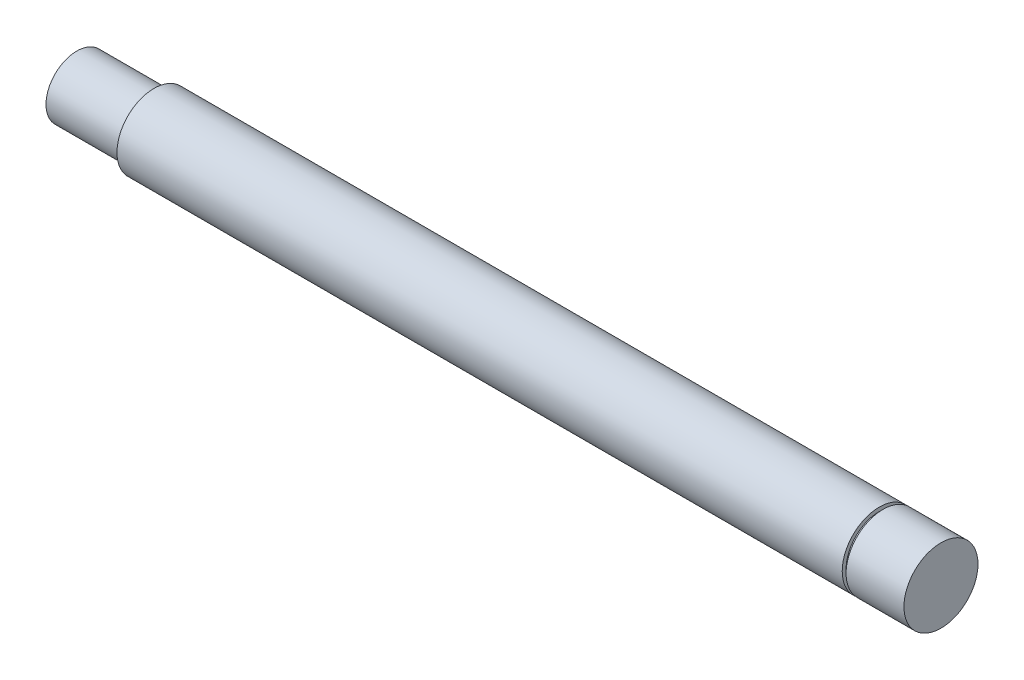
ISO-10303-21;
HEADER;
FILE_DESCRIPTION(('STEP AP214'),'2;1');
FILE_NAME('part.step','',(''),(''),'','','');
FILE_SCHEMA(('AUTOMOTIVE_DESIGN { 1 0 10303 214 1 1 1 1 }'));
ENDSEC;
DATA;
#1=APPLICATION_CONTEXT('core data for automotive mechanical design processes');
#2=APPLICATION_PROTOCOL_DEFINITION('international standard','automotive_design',2000,#1);
#3=PRODUCT_CONTEXT('',#1,'mechanical');
#4=PRODUCT('Part','Part','',(#3));
#5=PRODUCT_RELATED_PRODUCT_CATEGORY('part','',(#4));
#6=PRODUCT_DEFINITION_FORMATION('','',#4);
#7=PRODUCT_DEFINITION_CONTEXT('part definition',#1,'design');
#8=PRODUCT_DEFINITION('design','',#6,#7);
#9=PRODUCT_DEFINITION_SHAPE('','',#8);
#10=(LENGTH_UNIT() NAMED_UNIT(*) SI_UNIT(.MILLI.,.METRE.));
#11=(NAMED_UNIT(*) PLANE_ANGLE_UNIT() SI_UNIT($,.RADIAN.));
#12=(NAMED_UNIT(*) SI_UNIT($,.STERADIAN.) SOLID_ANGLE_UNIT());
#13=UNCERTAINTY_MEASURE_WITH_UNIT(LENGTH_MEASURE(1.E-05),#10,'distance_accuracy_value','');
#14=(GEOMETRIC_REPRESENTATION_CONTEXT(3) GLOBAL_UNCERTAINTY_ASSIGNED_CONTEXT((#13)) GLOBAL_UNIT_ASSIGNED_CONTEXT((#10,
#11,#12)) REPRESENTATION_CONTEXT('',''));
#15=CARTESIAN_POINT('',(0.,0.,0.));
#16=DIRECTION('',(0.,0.,1.));
#17=DIRECTION('',(1.,0.,0.));
#18=AXIS2_PLACEMENT_3D('',#15,#16,#17);
#19=CARTESIAN_POINT('',(177.8,0.,0.));
#20=DIRECTION('',(-1.,0.,0.));
#21=DIRECTION('',(0.,0.,1.));
#22=AXIS2_PLACEMENT_3D('',#19,#20,#21);
#23=CYLINDRICAL_SURFACE('',#22,7.62);
#24=CARTESIAN_POINT('',(165.1,0.,0.));
#25=DIRECTION('',(1.,0.,0.));
#26=DIRECTION('',(0.,0.,-1.));
#27=AXIS2_PLACEMENT_3D('',#24,#25,#26);
#28=CIRCLE('',#27,7.62);
#29=CARTESIAN_POINT('',(165.1,0.,-7.62));
#30=VERTEX_POINT('',#29);
#31=EDGE_CURVE('E44',#30,#30,#28,.T.);
#32=ORIENTED_EDGE('',*,*,#31,.F.);
#33=EDGE_LOOP('',(#32));
#34=FACE_BOUND('',#33,.T.);
#35=CARTESIAN_POINT('',(15.875,0.,0.));
#36=DIRECTION('',(-1.,0.,0.));
#37=DIRECTION('',(0.,0.,1.));
#38=AXIS2_PLACEMENT_3D('',#35,#36,#37);
#39=CIRCLE('',#38,7.62);
#40=CARTESIAN_POINT('',(15.875,0.,7.62));
#41=VERTEX_POINT('',#40);
#42=EDGE_CURVE('E58',#41,#41,#39,.T.);
#43=ORIENTED_EDGE('',*,*,#42,.F.);
#44=EDGE_LOOP('',(#43));
#45=FACE_BOUND('',#44,.T.);
#46=ADVANCED_FACE('F37',(#34,#45),#23,.T.);
#47=CARTESIAN_POINT('',(165.1,0.,0.));
#48=DIRECTION('',(1.,0.,0.));
#49=DIRECTION('',(0.,0.,-1.));
#50=AXIS2_PLACEMENT_3D('',#47,#48,#49);
#51=PLANE('',#50);
#52=CARTESIAN_POINT('',(165.1,0.,0.));
#53=DIRECTION('',(1.,0.,0.));
#54=DIRECTION('',(0.,0.,-1.));
#55=AXIS2_PLACEMENT_3D('',#52,#53,#54);
#56=CIRCLE('',#55,6.82625);
#57=CARTESIAN_POINT('',(165.1,0.,-6.82625));
#58=VERTEX_POINT('',#57);
#59=EDGE_CURVE('E53',#58,#58,#56,.T.);
#60=ORIENTED_EDGE('',*,*,#59,.F.);
#61=EDGE_LOOP('',(#60));
#62=FACE_BOUND('',#61,.T.);
#63=ORIENTED_EDGE('',*,*,#31,.T.);
#64=EDGE_LOOP('',(#63));
#65=FACE_BOUND('',#64,.T.);
#66=ADVANCED_FACE('F80',(#62,#65),#51,.T.);
#67=CARTESIAN_POINT('',(165.89375,0.,0.));
#68=DIRECTION('',(1.,0.,0.));
#69=DIRECTION('',(0.,0.,-1.));
#70=AXIS2_PLACEMENT_3D('',#67,#68,#69);
#71=PLANE('',#70);
#72=CARTESIAN_POINT('',(165.89375,0.,0.));
#73=DIRECTION('',(1.,0.,0.));
#74=DIRECTION('',(0.,0.,-1.));
#75=AXIS2_PLACEMENT_3D('',#72,#73,#74);
#76=CIRCLE('',#75,6.82625);
#77=CARTESIAN_POINT('',(165.89375,0.,-6.82625));
#78=VERTEX_POINT('',#77);
#79=EDGE_CURVE('E55',#78,#78,#76,.T.);
#80=ORIENTED_EDGE('',*,*,#79,.T.);
#81=EDGE_LOOP('',(#80));
#82=FACE_BOUND('',#81,.T.);
#83=CARTESIAN_POINT('',(165.89375,0.,0.));
#84=DIRECTION('',(1.,0.,0.));
#85=DIRECTION('',(0.,0.,-1.));
#86=AXIS2_PLACEMENT_3D('',#83,#84,#85);
#87=CIRCLE('',#86,7.62);
#88=CARTESIAN_POINT('',(165.89375,0.,-7.62));
#89=VERTEX_POINT('',#88);
#90=EDGE_CURVE('E48',#89,#89,#87,.T.);
#91=ORIENTED_EDGE('',*,*,#90,.F.);
#92=EDGE_LOOP('',(#91));
#93=FACE_BOUND('',#92,.T.);
#94=ADVANCED_FACE('F85',(#82,#93),#71,.F.);
#95=CARTESIAN_POINT('',(165.1,0.,0.));
#96=DIRECTION('',(1.,0.,0.));
#97=DIRECTION('',(0.,0.,-1.));
#98=AXIS2_PLACEMENT_3D('',#95,#96,#97);
#99=CYLINDRICAL_SURFACE('',#98,6.82625);
#100=ORIENTED_EDGE('',*,*,#59,.T.);
#101=EDGE_LOOP('',(#100));
#102=FACE_BOUND('',#101,.T.);
#103=ORIENTED_EDGE('',*,*,#79,.F.);
#104=EDGE_LOOP('',(#103));
#105=FACE_BOUND('',#104,.T.);
#106=ADVANCED_FACE('F94',(#102,#105),#99,.T.);
#107=CARTESIAN_POINT('',(177.8,0.,0.));
#108=DIRECTION('',(1.,0.,0.));
#109=DIRECTION('',(0.,0.,-1.));
#110=AXIS2_PLACEMENT_3D('',#107,#108,#109);
#111=PLANE('',#110);
#112=CARTESIAN_POINT('',(177.8,0.,0.));
#113=DIRECTION('',(1.,0.,0.));
#114=DIRECTION('',(0.,0.,-1.));
#115=AXIS2_PLACEMENT_3D('',#112,#113,#114);
#116=CIRCLE('',#115,7.62);
#117=CARTESIAN_POINT('',(177.8,0.,-7.62));
#118=VERTEX_POINT('',#117);
#119=EDGE_CURVE('E10',#118,#118,#116,.T.);
#120=ORIENTED_EDGE('',*,*,#119,.T.);
#121=EDGE_LOOP('',(#120));
#122=FACE_BOUND('',#121,.T.);
#123=ADVANCED_FACE('F89',(#122),#111,.T.);
#124=ORIENTED_EDGE('',*,*,#90,.T.);
#125=EDGE_LOOP('',(#124));
#126=FACE_BOUND('',#125,.T.);
#127=ORIENTED_EDGE('',*,*,#119,.F.);
#128=EDGE_LOOP('',(#127));
#129=FACE_BOUND('',#128,.T.);
#130=ADVANCED_FACE('F39',(#126,#129),#23,.T.);
#131=CARTESIAN_POINT('',(15.875,0.,0.));
#132=DIRECTION('',(-1.,0.,0.));
#133=DIRECTION('',(0.,0.,1.));
#134=AXIS2_PLACEMENT_3D('',#131,#132,#133);
#135=PLANE('',#134);
#136=CARTESIAN_POINT('',(15.875,0.,0.));
#137=DIRECTION('',(-1.,0.,0.));
#138=DIRECTION('',(0.,0.,1.));
#139=AXIS2_PLACEMENT_3D('',#136,#137,#138);
#140=CIRCLE('',#139,6.35);
#141=CARTESIAN_POINT('',(15.875,0.,6.35));
#142=VERTEX_POINT('',#141);
#143=EDGE_CURVE('E63',#142,#142,#140,.T.);
#144=ORIENTED_EDGE('',*,*,#143,.F.);
#145=EDGE_LOOP('',(#144));
#146=FACE_BOUND('',#145,.T.);
#147=ORIENTED_EDGE('',*,*,#42,.T.);
#148=EDGE_LOOP('',(#147));
#149=FACE_BOUND('',#148,.T.);
#150=ADVANCED_FACE('F73',(#146,#149),#135,.T.);
#151=CARTESIAN_POINT('',(15.875,0.,0.));
#152=DIRECTION('',(-1.,0.,0.));
#153=DIRECTION('',(0.,0.,1.));
#154=AXIS2_PLACEMENT_3D('',#151,#152,#153);
#155=CYLINDRICAL_SURFACE('',#154,6.35);
#156=ORIENTED_EDGE('',*,*,#143,.T.);
#157=EDGE_LOOP('',(#156));
#158=FACE_BOUND('',#157,.T.);
#159=CARTESIAN_POINT('',(0.,0.,0.));
#160=DIRECTION('',(-1.,0.,0.));
#161=DIRECTION('',(0.,0.,1.));
#162=AXIS2_PLACEMENT_3D('',#159,#160,#161);
#163=CIRCLE('',#162,6.35);
#164=CARTESIAN_POINT('',(0.,0.,6.35));
#165=VERTEX_POINT('',#164);
#166=EDGE_CURVE('E64',#165,#165,#163,.T.);
#167=ORIENTED_EDGE('',*,*,#166,.F.);
#168=EDGE_LOOP('',(#167));
#169=FACE_BOUND('',#168,.T.);
#170=ADVANCED_FACE('F70',(#158,#169),#155,.T.);
#171=CARTESIAN_POINT('',(0.,0.,0.));
#172=DIRECTION('',(1.,0.,0.));
#173=DIRECTION('',(0.,0.,-1.));
#174=AXIS2_PLACEMENT_3D('',#171,#172,#173);
#175=PLANE('',#174);
#176=ORIENTED_EDGE('',*,*,#166,.T.);
#177=EDGE_LOOP('',(#176));
#178=FACE_BOUND('',#177,.T.);
#179=ADVANCED_FACE('F107',(#178),#175,.F.);
#180=CLOSED_SHELL('',(#46,#66,#94,#106,#123,#130,#150,#170,#179));
#181=MANIFOLD_SOLID_BREP('B2',#180);
#182=ADVANCED_BREP_SHAPE_REPRESENTATION('',(#18,#181),#14);
#183=SHAPE_DEFINITION_REPRESENTATION(#9,#182);
ENDSEC;
END-ISO-10303-21;
